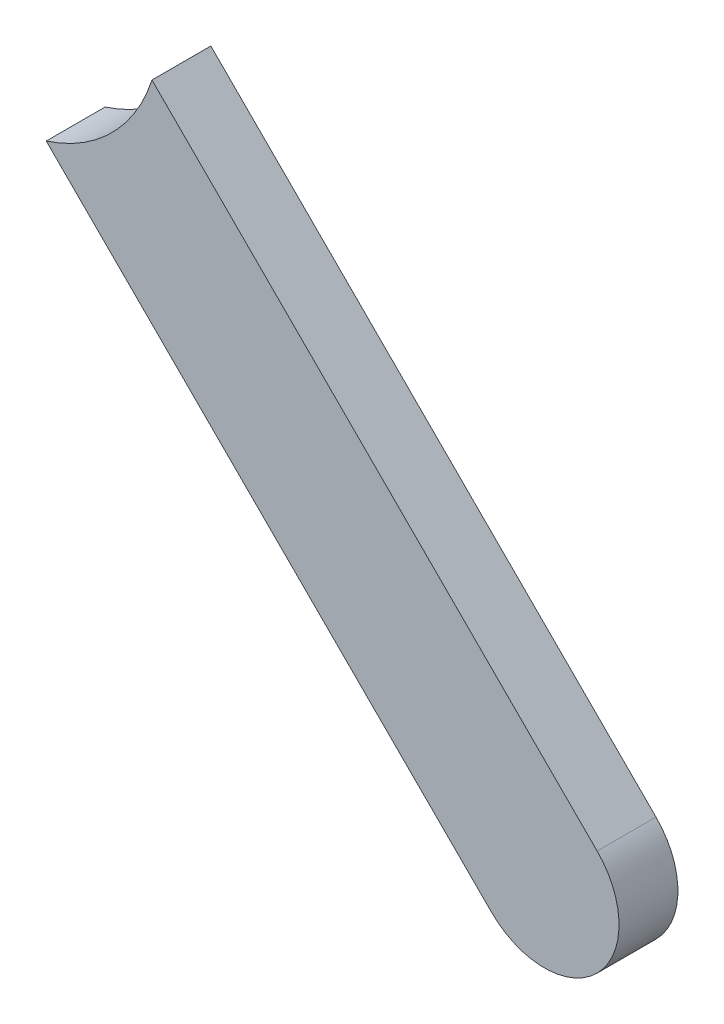
ISO-10303-21;
HEADER;
FILE_DESCRIPTION(('STEP AP214'),'2;1');
FILE_NAME('part.step','',(''),(''),'','','');
FILE_SCHEMA(('AUTOMOTIVE_DESIGN { 1 0 10303 214 1 1 1 1 }'));
ENDSEC;
DATA;
#1=APPLICATION_CONTEXT('core data for automotive mechanical design processes');
#2=APPLICATION_PROTOCOL_DEFINITION('international standard','automotive_design',2000,#1);
#3=PRODUCT_CONTEXT('',#1,'mechanical');
#4=PRODUCT('Part','Part','',(#3));
#5=PRODUCT_RELATED_PRODUCT_CATEGORY('part','',(#4));
#6=PRODUCT_DEFINITION_FORMATION('','',#4);
#7=PRODUCT_DEFINITION_CONTEXT('part definition',#1,'design');
#8=PRODUCT_DEFINITION('design','',#6,#7);
#9=PRODUCT_DEFINITION_SHAPE('','',#8);
#10=(LENGTH_UNIT() NAMED_UNIT(*) SI_UNIT(.MILLI.,.METRE.));
#11=(NAMED_UNIT(*) PLANE_ANGLE_UNIT() SI_UNIT($,.RADIAN.));
#12=(NAMED_UNIT(*) SI_UNIT($,.STERADIAN.) SOLID_ANGLE_UNIT());
#13=UNCERTAINTY_MEASURE_WITH_UNIT(LENGTH_MEASURE(1.E-05),#10,'distance_accuracy_value','');
#14=(GEOMETRIC_REPRESENTATION_CONTEXT(3) GLOBAL_UNCERTAINTY_ASSIGNED_CONTEXT((#13)) GLOBAL_UNIT_ASSIGNED_CONTEXT((#10,
#11,#12)) REPRESENTATION_CONTEXT('',''));
#15=CARTESIAN_POINT('',(0.,0.,0.));
#16=DIRECTION('',(0.,0.,1.));
#17=DIRECTION('',(1.,0.,0.));
#18=AXIS2_PLACEMENT_3D('',#15,#16,#17);
#19=CARTESIAN_POINT('',(113.954064664847,110.850461595153,0.));
#20=DIRECTION('',(0.707106781186545,0.70710678118655,0.));
#21=DIRECTION('',(0.70710678118655,-0.707106781186545,0.));
#22=AXIS2_PLACEMENT_3D('',#19,#20,#21);
#23=PLANE('',#22);
#24=DIRECTION('',(0.70710678118655,-0.707106781186545,0.));
#25=VECTOR('',#24,1.);
#26=CARTESIAN_POINT('',(113.6051322,111.19939406,0.1999996));
#27=LINE('',#26,#25);
#28=CARTESIAN_POINT('',(113.954064664847,110.850461595153,0.1999996));
#29=VERTEX_POINT('',#28);
#30=CARTESIAN_POINT('',(115.46659406,109.3379322,0.1999996));
#31=VERTEX_POINT('',#30);
#32=EDGE_CURVE('E11',#29,#31,#27,.T.);
#33=ORIENTED_EDGE('',*,*,#32,.F.);
#34=DIRECTION('',(0.,0.,1.));
#35=VECTOR('',#34,1.);
#36=CARTESIAN_POINT('',(113.954064664847,110.850461595153,0.));
#37=LINE('',#36,#35);
#38=CARTESIAN_POINT('',(113.954064664847,110.850461595153,0.));
#39=VERTEX_POINT('',#38);
#40=EDGE_CURVE('E24',#39,#29,#37,.T.);
#41=ORIENTED_EDGE('',*,*,#40,.F.);
#42=DIRECTION('',(0.70710678118655,-0.707106781186545,0.));
#43=VECTOR('',#42,1.);
#44=CARTESIAN_POINT('',(113.6051322,111.19939406,0.));
#45=LINE('',#44,#43);
#46=CARTESIAN_POINT('',(115.46659406,109.3379322,0.));
#47=VERTEX_POINT('',#46);
#48=EDGE_CURVE('E75',#39,#47,#45,.T.);
#49=ORIENTED_EDGE('',*,*,#48,.T.);
#50=DIRECTION('',(0.,0.,1.));
#51=VECTOR('',#50,1.);
#52=CARTESIAN_POINT('',(115.46659406,109.3379322,0.));
#53=LINE('',#52,#51);
#54=EDGE_CURVE('E37',#47,#31,#53,.T.);
#55=ORIENTED_EDGE('',*,*,#54,.T.);
#56=EDGE_LOOP('',(#33,#41,#49,#55));
#57=FACE_BOUND('',#56,.T.);
#58=ADVANCED_FACE('F17',(#57),#23,.F.);
#59=CARTESIAN_POINT('',(115.64619873,109.51753687,0.));
#60=DIRECTION('',(0.,0.,-1.));
#61=DIRECTION('',(-0.707106781186548,-0.707106781186548,0.));
#62=AXIS2_PLACEMENT_3D('',#59,#60,#61);
#63=CYLINDRICAL_SURFACE('',#62,0.253999360179549);
#64=CARTESIAN_POINT('',(115.64619873,109.51753687,0.1999996));
#65=DIRECTION('',(0.,0.,1.));
#66=DIRECTION('',(-0.707106781186548,-0.707106781186548,0.));
#67=AXIS2_PLACEMENT_3D('',#64,#65,#66);
#68=CIRCLE('',#67,0.253999360179549);
#69=CARTESIAN_POINT('',(115.8258034,109.69714154,0.1999996));
#70=VERTEX_POINT('',#69);
#71=EDGE_CURVE('E83',#31,#70,#68,.T.);
#72=ORIENTED_EDGE('',*,*,#71,.F.);
#73=ORIENTED_EDGE('',*,*,#54,.F.);
#74=CARTESIAN_POINT('',(115.64619873,109.51753687,0.));
#75=DIRECTION('',(0.,0.,1.));
#76=DIRECTION('',(-0.707106781186548,-0.707106781186548,0.));
#77=AXIS2_PLACEMENT_3D('',#74,#75,#76);
#78=CIRCLE('',#77,0.253999360179549);
#79=CARTESIAN_POINT('',(115.8258034,109.69714154,0.));
#80=VERTEX_POINT('',#79);
#81=EDGE_CURVE('E81',#47,#80,#78,.T.);
#82=ORIENTED_EDGE('',*,*,#81,.T.);
#83=DIRECTION('',(0.,0.,1.));
#84=VECTOR('',#83,1.);
#85=CARTESIAN_POINT('',(115.8258034,109.69714154,0.));
#86=LINE('',#85,#84);
#87=EDGE_CURVE('E67',#80,#70,#86,.T.);
#88=ORIENTED_EDGE('',*,*,#87,.T.);
#89=EDGE_LOOP('',(#72,#73,#82,#88));
#90=FACE_BOUND('',#89,.T.);
#91=ADVANCED_FACE('F89',(#90),#63,.T.);
#92=CARTESIAN_POINT('',(115.8258034,109.69714154,0.));
#93=DIRECTION('',(-0.707106781186548,-0.707106781186548,0.));
#94=DIRECTION('',(-0.707106781186548,0.707106781186548,0.));
#95=AXIS2_PLACEMENT_3D('',#92,#93,#94);
#96=PLANE('',#95);
#97=DIRECTION('',(-0.707106781186548,0.707106781186548,0.));
#98=VECTOR('',#97,1.);
#99=CARTESIAN_POINT('',(115.8258034,109.69714154,0.1999996));
#100=LINE('',#99,#98);
#101=CARTESIAN_POINT('',(114.313274004847,111.209670935153,0.1999996));
#102=VERTEX_POINT('',#101);
#103=EDGE_CURVE('E71',#70,#102,#100,.T.);
#104=ORIENTED_EDGE('',*,*,#103,.F.);
#105=ORIENTED_EDGE('',*,*,#87,.F.);
#106=DIRECTION('',(-0.707106781186548,0.707106781186548,0.));
#107=VECTOR('',#106,1.);
#108=CARTESIAN_POINT('',(115.8258034,109.69714154,0.));
#109=LINE('',#108,#107);
#110=CARTESIAN_POINT('',(114.313274004847,111.209670935153,0.));
#111=VERTEX_POINT('',#110);
#112=EDGE_CURVE('E63',#80,#111,#109,.T.);
#113=ORIENTED_EDGE('',*,*,#112,.T.);
#114=DIRECTION('',(0.,0.,1.));
#115=VECTOR('',#114,1.);
#116=CARTESIAN_POINT('',(114.313274004847,111.209670935153,0.));
#117=LINE('',#116,#115);
#118=EDGE_CURVE('E53',#111,#102,#117,.T.);
#119=ORIENTED_EDGE('',*,*,#118,.T.);
#120=EDGE_LOOP('',(#104,#105,#113,#119));
#121=FACE_BOUND('',#120,.T.);
#122=ADVANCED_FACE('F66',(#121),#96,.F.);
#123=CARTESIAN_POINT('',(113.7847356,111.379,0.));
#124=DIRECTION('',(0.,0.,-1.));
#125=DIRECTION('',(1.,0.,0.));
#126=AXIS2_PLACEMENT_3D('',#123,#124,#125);
#127=CYLINDRICAL_SURFACE('',#126,0.55500016);
#128=ORIENTED_EDGE('',*,*,#40,.T.);
#129=CARTESIAN_POINT('',(113.7847356,111.379,0.1999996));
#130=DIRECTION('',(0.,0.,1.));
#131=DIRECTION('',(1.,0.,0.));
#132=AXIS2_PLACEMENT_3D('',#129,#130,#131);
#133=CIRCLE('',#132,0.55500016);
#134=EDGE_CURVE('E59',#29,#102,#133,.T.);
#135=ORIENTED_EDGE('',*,*,#134,.T.);
#136=ORIENTED_EDGE('',*,*,#118,.F.);
#137=CARTESIAN_POINT('',(113.7847356,111.379,0.));
#138=DIRECTION('',(0.,0.,1.));
#139=DIRECTION('',(1.,0.,0.));
#140=AXIS2_PLACEMENT_3D('',#137,#138,#139);
#141=CIRCLE('',#140,0.55500016);
#142=EDGE_CURVE('E57',#39,#111,#141,.T.);
#143=ORIENTED_EDGE('',*,*,#142,.F.);
#144=EDGE_LOOP('',(#128,#135,#136,#143));
#145=FACE_BOUND('',#144,.T.);
#146=ADVANCED_FACE('F55',(#145),#127,.F.);
#147=CARTESIAN_POINT('',(113.6051322,111.19939406,0.));
#148=DIRECTION('',(0.,0.,-1.));
#149=DIRECTION('',(-1.,0.,0.));
#150=AXIS2_PLACEMENT_3D('',#147,#148,#149);
#151=PLANE('',#150);
#152=ORIENTED_EDGE('',*,*,#48,.F.);
#153=ORIENTED_EDGE('',*,*,#142,.T.);
#154=ORIENTED_EDGE('',*,*,#112,.F.);
#155=ORIENTED_EDGE('',*,*,#81,.F.);
#156=EDGE_LOOP('',(#152,#153,#154,#155));
#157=FACE_BOUND('',#156,.T.);
#158=ADVANCED_FACE('F74',(#157),#151,.T.);
#159=CARTESIAN_POINT('',(113.6051322,111.19939406,0.1999996));
#160=DIRECTION('',(0.,0.,-1.));
#161=DIRECTION('',(-1.,0.,0.));
#162=AXIS2_PLACEMENT_3D('',#159,#160,#161);
#163=PLANE('',#162);
#164=ORIENTED_EDGE('',*,*,#134,.F.);
#165=ORIENTED_EDGE('',*,*,#32,.T.);
#166=ORIENTED_EDGE('',*,*,#71,.T.);
#167=ORIENTED_EDGE('',*,*,#103,.T.);
#168=EDGE_LOOP('',(#164,#165,#166,#167));
#169=FACE_BOUND('',#168,.T.);
#170=ADVANCED_FACE('F91',(#169),#163,.F.);
#171=CLOSED_SHELL('',(#58,#91,#122,#146,#158,#170));
#172=MANIFOLD_SOLID_BREP('B1',#171);
#173=ADVANCED_BREP_SHAPE_REPRESENTATION('',(#18,#172),#14);
#174=SHAPE_DEFINITION_REPRESENTATION(#9,#173);
ENDSEC;
END-ISO-10303-21;
